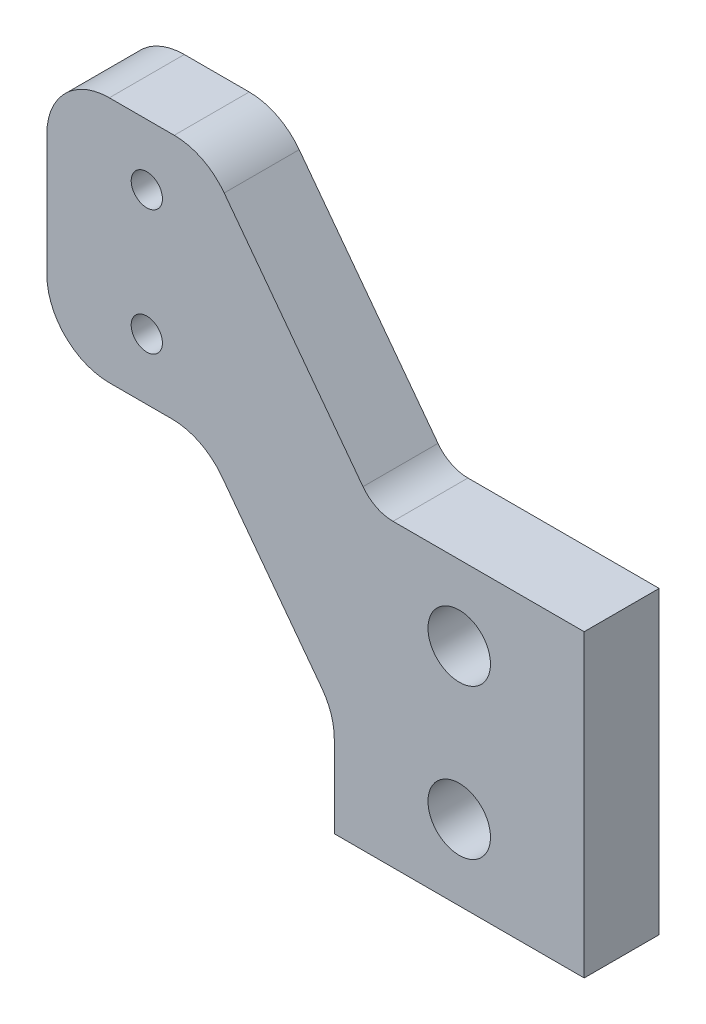
ISO-10303-21;
HEADER;
FILE_DESCRIPTION(('STEP AP214'),'2;1');
FILE_NAME('part.step','',(''),(''),'','','');
FILE_SCHEMA(('AUTOMOTIVE_DESIGN { 1 0 10303 214 1 1 1 1 }'));
ENDSEC;
DATA;
#1=APPLICATION_CONTEXT('core data for automotive mechanical design processes');
#2=APPLICATION_PROTOCOL_DEFINITION('international standard','automotive_design',2000,#1);
#3=PRODUCT_CONTEXT('',#1,'mechanical');
#4=PRODUCT('Part','Part','',(#3));
#5=PRODUCT_RELATED_PRODUCT_CATEGORY('part','',(#4));
#6=PRODUCT_DEFINITION_FORMATION('','',#4);
#7=PRODUCT_DEFINITION_CONTEXT('part definition',#1,'design');
#8=PRODUCT_DEFINITION('design','',#6,#7);
#9=PRODUCT_DEFINITION_SHAPE('','',#8);
#10=(LENGTH_UNIT() NAMED_UNIT(*) SI_UNIT(.MILLI.,.METRE.));
#11=(NAMED_UNIT(*) PLANE_ANGLE_UNIT() SI_UNIT($,.RADIAN.));
#12=(NAMED_UNIT(*) SI_UNIT($,.STERADIAN.) SOLID_ANGLE_UNIT());
#13=UNCERTAINTY_MEASURE_WITH_UNIT(LENGTH_MEASURE(1.E-05),#10,'distance_accuracy_value','');
#14=(GEOMETRIC_REPRESENTATION_CONTEXT(3) GLOBAL_UNCERTAINTY_ASSIGNED_CONTEXT((#13)) GLOBAL_UNIT_ASSIGNED_CONTEXT((#10,
#11,#12)) REPRESENTATION_CONTEXT('',''));
#15=CARTESIAN_POINT('',(0.,0.,0.));
#16=DIRECTION('',(0.,0.,1.));
#17=DIRECTION('',(1.,0.,0.));
#18=AXIS2_PLACEMENT_3D('',#15,#16,#17);
#19=CARTESIAN_POINT('',(5.30636675128094,-35.3975404851727,6.));
#20=DIRECTION('',(0.,0.,1.));
#21=DIRECTION('',(1.,0.,0.));
#22=AXIS2_PLACEMENT_3D('',#19,#20,#21);
#23=PLANE('',#22);
#24=CARTESIAN_POINT('',(-4.69363324871907,-4.875,6.));
#25=DIRECTION('',(0.,0.,1.));
#26=DIRECTION('',(1.,0.,0.));
#27=AXIS2_PLACEMENT_3D('',#24,#25,#26);
#28=CIRCLE('',#27,1.25);
#29=CARTESIAN_POINT('',(-3.44363324871907,-4.875,6.));
#30=VERTEX_POINT('',#29);
#31=EDGE_CURVE('E300',#30,#30,#28,.T.);
#32=ORIENTED_EDGE('',*,*,#31,.F.);
#33=EDGE_LOOP('',(#32));
#34=FACE_BOUND('',#33,.T.);
#35=CARTESIAN_POINT('',(20.3063667512809,-36.,6.));
#36=DIRECTION('',(0.,0.,1.));
#37=DIRECTION('',(1.,0.,0.));
#38=AXIS2_PLACEMENT_3D('',#35,#36,#37);
#39=CIRCLE('',#38,2.5);
#40=CARTESIAN_POINT('',(22.8063667512809,-36.,6.));
#41=VERTEX_POINT('',#40);
#42=EDGE_CURVE('E181',#41,#41,#39,.T.);
#43=ORIENTED_EDGE('',*,*,#42,.F.);
#44=EDGE_LOOP('',(#43));
#45=FACE_BOUND('',#44,.T.);
#46=DIRECTION('',(0.,1.,0.));
#47=VECTOR('',#46,1.);
#48=CARTESIAN_POINT('',(30.3063667512809,-18.,6.));
#49=LINE('',#48,#47);
#50=CARTESIAN_POINT('',(30.3063667512809,-42.,6.));
#51=VERTEX_POINT('',#50);
#52=CARTESIAN_POINT('',(30.3063667512809,-18.,6.));
#53=VERTEX_POINT('',#52);
#54=EDGE_CURVE('E52',#51,#53,#49,.T.);
#55=ORIENTED_EDGE('',*,*,#54,.T.);
#56=DIRECTION('',(-1.,0.,0.));
#57=VECTOR('',#56,1.);
#58=CARTESIAN_POINT('',(15.0054751822955,-18.,6.));
#59=LINE('',#58,#57);
#60=CARTESIAN_POINT('',(15.0054751822955,-18.,6.));
#61=VERTEX_POINT('',#60);
#62=EDGE_CURVE('E117',#53,#61,#59,.T.);
#63=ORIENTED_EDGE('',*,*,#62,.T.);
#64=CARTESIAN_POINT('',(15.0054751822955,-15.,6.));
#65=DIRECTION('',(0.,0.,-1.));
#66=DIRECTION('',(-1.,0.,0.));
#67=AXIS2_PLACEMENT_3D('',#64,#65,#66);
#68=CIRCLE('',#67,3.);
#69=CARTESIAN_POINT('',(12.6058506112339,-16.8005004631928,6.));
#70=VERTEX_POINT('',#69);
#71=EDGE_CURVE('E241',#61,#70,#68,.T.);
#72=ORIENTED_EDGE('',*,*,#71,.T.);
#73=DIRECTION('',(-0.600166821064255,0.799874857020538,0.));
#74=VECTOR('',#73,1.);
#75=CARTESIAN_POINT('',(1.5000259468821,-1.99916589467874,6.));
#76=LINE('',#75,#74);
#77=CARTESIAN_POINT('',(1.5000259468821,-1.99916589467874,6.));
#78=VERTEX_POINT('',#77);
#79=EDGE_CURVE('E261',#70,#78,#76,.T.);
#80=ORIENTED_EDGE('',*,*,#79,.T.);
#81=CARTESIAN_POINT('',(-2.4993483382206,-5.,6.));
#82=DIRECTION('',(0.,0.,1.));
#83=DIRECTION('',(1.,0.,0.));
#84=AXIS2_PLACEMENT_3D('',#81,#82,#83);
#85=CIRCLE('',#84,5.);
#86=CARTESIAN_POINT('',(-2.49934833822063,0.,6.));
#87=VERTEX_POINT('',#86);
#88=EDGE_CURVE('E258',#78,#87,#85,.T.);
#89=ORIENTED_EDGE('',*,*,#88,.T.);
#90=DIRECTION('',(-1.,0.,0.));
#91=VECTOR('',#90,1.);
#92=CARTESIAN_POINT('',(-7.69363324871906,0.,6.));
#93=LINE('',#92,#91);
#94=CARTESIAN_POINT('',(-7.69363324871906,0.,6.));
#95=VERTEX_POINT('',#94);
#96=EDGE_CURVE('E260',#87,#95,#93,.T.);
#97=ORIENTED_EDGE('',*,*,#96,.T.);
#98=CARTESIAN_POINT('',(-7.69363324871906,-5.,6.));
#99=DIRECTION('',(0.,0.,1.));
#100=DIRECTION('',(-1.,0.,0.));
#101=AXIS2_PLACEMENT_3D('',#98,#99,#100);
#102=CIRCLE('',#101,5.);
#103=CARTESIAN_POINT('',(-12.6936332487191,-5.,6.));
#104=VERTEX_POINT('',#103);
#105=EDGE_CURVE('E263',#95,#104,#102,.T.);
#106=ORIENTED_EDGE('',*,*,#105,.T.);
#107=DIRECTION('',(0.,-1.,0.));
#108=VECTOR('',#107,1.);
#109=CARTESIAN_POINT('',(-12.6936332487191,-14.75,6.));
#110=LINE('',#109,#108);
#111=CARTESIAN_POINT('',(-12.6936332487191,-14.75,6.));
#112=VERTEX_POINT('',#111);
#113=EDGE_CURVE('E269',#104,#112,#110,.T.);
#114=ORIENTED_EDGE('',*,*,#113,.T.);
#115=CARTESIAN_POINT('',(-7.69363324871906,-14.75,6.));
#116=DIRECTION('',(0.,0.,1.));
#117=DIRECTION('',(-1.,0.,0.));
#118=AXIS2_PLACEMENT_3D('',#115,#116,#117);
#119=CIRCLE('',#118,5.);
#120=CARTESIAN_POINT('',(-7.69363324871906,-19.75,6.));
#121=VERTEX_POINT('',#120);
#122=EDGE_CURVE('E271',#112,#121,#119,.T.);
#123=ORIENTED_EDGE('',*,*,#122,.T.);
#124=DIRECTION('',(1.,0.,0.));
#125=VECTOR('',#124,1.);
#126=CARTESIAN_POINT('',(-2.6827586338354,-19.75,6.));
#127=LINE('',#126,#125);
#128=CARTESIAN_POINT('',(-2.6827586338354,-19.75,6.));
#129=VERTEX_POINT('',#128);
#130=EDGE_CURVE('E273',#121,#129,#127,.T.);
#131=ORIENTED_EDGE('',*,*,#130,.T.);
#132=CARTESIAN_POINT('',(-2.68275863383537,-24.75,6.));
#133=DIRECTION('',(0.,0.,-1.));
#134=DIRECTION('',(1.,0.,0.));
#135=AXIS2_PLACEMENT_3D('',#132,#133,#134);
#136=CIRCLE('',#135,5.);
#137=CARTESIAN_POINT('',(1.31661565126733,-21.7491658946787,6.));
#138=VERTEX_POINT('',#137);
#139=EDGE_CURVE('E275',#129,#138,#136,.T.);
#140=ORIENTED_EDGE('',*,*,#139,.T.);
#141=DIRECTION('',(0.600166821064255,-0.799874857020538,0.));
#142=VECTOR('',#141,1.);
#143=CARTESIAN_POINT('',(9.30574103638362,-32.3967063798514,6.));
#144=LINE('',#143,#142);
#145=CARTESIAN_POINT('',(9.30574103638362,-32.3967063798514,6.));
#146=VERTEX_POINT('',#145);
#147=EDGE_CURVE('E158',#138,#146,#144,.T.);
#148=ORIENTED_EDGE('',*,*,#147,.T.);
#149=CARTESIAN_POINT('',(5.30636675128094,-35.3975404851727,6.));
#150=DIRECTION('',(0.,0.,-1.));
#151=DIRECTION('',(1.,0.,0.));
#152=AXIS2_PLACEMENT_3D('',#149,#150,#151);
#153=CIRCLE('',#152,5.);
#154=CARTESIAN_POINT('',(10.3063667512809,-35.3975404851727,6.));
#155=VERTEX_POINT('',#154);
#156=EDGE_CURVE('E152',#146,#155,#153,.T.);
#157=ORIENTED_EDGE('',*,*,#156,.T.);
#158=DIRECTION('',(0.,-1.,0.));
#159=VECTOR('',#158,1.);
#160=CARTESIAN_POINT('',(10.3063667512809,-42.,6.));
#161=LINE('',#160,#159);
#162=CARTESIAN_POINT('',(10.3063667512809,-42.,6.));
#163=VERTEX_POINT('',#162);
#164=EDGE_CURVE('E156',#155,#163,#161,.T.);
#165=ORIENTED_EDGE('',*,*,#164,.T.);
#166=DIRECTION('',(1.,0.,0.));
#167=VECTOR('',#166,1.);
#168=CARTESIAN_POINT('',(30.3063667512809,-42.,6.));
#169=LINE('',#168,#167);
#170=EDGE_CURVE('E172',#163,#51,#169,.T.);
#171=ORIENTED_EDGE('',*,*,#170,.T.);
#172=EDGE_LOOP('',(#55,#63,#72,#80,#89,#97,#106,#114,#123,#131,#140,#148,#157,#165,#171));
#173=FACE_BOUND('',#172,.T.);
#174=CARTESIAN_POINT('',(20.3063667512809,-24.,6.));
#175=DIRECTION('',(0.,0.,1.));
#176=DIRECTION('',(1.,0.,0.));
#177=AXIS2_PLACEMENT_3D('',#174,#175,#176);
#178=CIRCLE('',#177,2.5);
#179=CARTESIAN_POINT('',(22.8063667512809,-24.,6.));
#180=VERTEX_POINT('',#179);
#181=EDGE_CURVE('E294',#180,#180,#178,.T.);
#182=ORIENTED_EDGE('',*,*,#181,.F.);
#183=EDGE_LOOP('',(#182));
#184=FACE_BOUND('',#183,.T.);
#185=CARTESIAN_POINT('',(-4.69363324871906,-14.875,6.));
#186=DIRECTION('',(0.,0.,1.));
#187=DIRECTION('',(1.,0.,0.));
#188=AXIS2_PLACEMENT_3D('',#185,#186,#187);
#189=CIRCLE('',#188,1.25);
#190=CARTESIAN_POINT('',(-3.44363324871906,-14.875,6.));
#191=VERTEX_POINT('',#190);
#192=EDGE_CURVE('E306',#191,#191,#189,.T.);
#193=ORIENTED_EDGE('',*,*,#192,.F.);
#194=EDGE_LOOP('',(#193));
#195=FACE_BOUND('',#194,.T.);
#196=ADVANCED_FACE('F35',(#34,#45,#173,#184,#195),#23,.T.);
#197=CARTESIAN_POINT('',(5.30636675128094,-35.3975404851727,0.));
#198=DIRECTION('',(0.,0.,1.));
#199=DIRECTION('',(1.,0.,0.));
#200=AXIS2_PLACEMENT_3D('',#197,#198,#199);
#201=PLANE('',#200);
#202=DIRECTION('',(-1.,0.,0.));
#203=VECTOR('',#202,1.);
#204=CARTESIAN_POINT('',(15.0054751822955,-18.,0.));
#205=LINE('',#204,#203);
#206=CARTESIAN_POINT('',(30.3063667512809,-18.,0.));
#207=VERTEX_POINT('',#206);
#208=CARTESIAN_POINT('',(15.0054751822955,-18.,0.));
#209=VERTEX_POINT('',#208);
#210=EDGE_CURVE('E178',#207,#209,#205,.T.);
#211=ORIENTED_EDGE('',*,*,#210,.F.);
#212=DIRECTION('',(0.,1.,0.));
#213=VECTOR('',#212,1.);
#214=CARTESIAN_POINT('',(30.3063667512809,-32.6148542997745,0.));
#215=LINE('',#214,#213);
#216=CARTESIAN_POINT('',(30.3063667512809,-42.,0.));
#217=VERTEX_POINT('',#216);
#218=EDGE_CURVE('E204',#217,#207,#215,.T.);
#219=ORIENTED_EDGE('',*,*,#218,.F.);
#220=DIRECTION('',(1.,0.,0.));
#221=VECTOR('',#220,1.);
#222=CARTESIAN_POINT('',(30.3063667512809,-42.,0.));
#223=LINE('',#222,#221);
#224=CARTESIAN_POINT('',(10.3063667512809,-42.,0.));
#225=VERTEX_POINT('',#224);
#226=EDGE_CURVE('E110',#225,#217,#223,.T.);
#227=ORIENTED_EDGE('',*,*,#226,.F.);
#228=DIRECTION('',(0.,-1.,0.));
#229=VECTOR('',#228,1.);
#230=CARTESIAN_POINT('',(10.3063667512809,-42.,0.));
#231=LINE('',#230,#229);
#232=CARTESIAN_POINT('',(10.3063667512809,-35.3975404851727,0.));
#233=VERTEX_POINT('',#232);
#234=EDGE_CURVE('E103',#233,#225,#231,.T.);
#235=ORIENTED_EDGE('',*,*,#234,.F.);
#236=CARTESIAN_POINT('',(5.30636675128094,-35.3975404851727,0.));
#237=DIRECTION('',(0.,0.,-1.));
#238=DIRECTION('',(1.,0.,0.));
#239=AXIS2_PLACEMENT_3D('',#236,#237,#238);
#240=CIRCLE('',#239,5.);
#241=CARTESIAN_POINT('',(9.30574103638362,-32.3967063798514,0.));
#242=VERTEX_POINT('',#241);
#243=EDGE_CURVE('E166',#242,#233,#240,.T.);
#244=ORIENTED_EDGE('',*,*,#243,.F.);
#245=DIRECTION('',(0.600166821064255,-0.799874857020538,0.));
#246=VECTOR('',#245,1.);
#247=CARTESIAN_POINT('',(9.30574103638362,-32.3967063798514,0.));
#248=LINE('',#247,#246);
#249=CARTESIAN_POINT('',(1.31661565126733,-21.7491658946787,0.));
#250=VERTEX_POINT('',#249);
#251=EDGE_CURVE('E199',#250,#242,#248,.T.);
#252=ORIENTED_EDGE('',*,*,#251,.F.);
#253=CARTESIAN_POINT('',(-2.68275863383537,-24.75,0.));
#254=DIRECTION('',(0.,0.,-1.));
#255=DIRECTION('',(1.,0.,0.));
#256=AXIS2_PLACEMENT_3D('',#253,#254,#255);
#257=CIRCLE('',#256,5.);
#258=CARTESIAN_POINT('',(-2.6827586338354,-19.75,0.));
#259=VERTEX_POINT('',#258);
#260=EDGE_CURVE('E197',#259,#250,#257,.T.);
#261=ORIENTED_EDGE('',*,*,#260,.F.);
#262=DIRECTION('',(1.,0.,0.));
#263=VECTOR('',#262,1.);
#264=CARTESIAN_POINT('',(-2.6827586338354,-19.75,0.));
#265=LINE('',#264,#263);
#266=CARTESIAN_POINT('',(-7.69363324871906,-19.75,0.));
#267=VERTEX_POINT('',#266);
#268=EDGE_CURVE('E195',#267,#259,#265,.T.);
#269=ORIENTED_EDGE('',*,*,#268,.F.);
#270=CARTESIAN_POINT('',(-7.69363324871906,-14.75,0.));
#271=DIRECTION('',(0.,0.,1.));
#272=DIRECTION('',(-1.,0.,0.));
#273=AXIS2_PLACEMENT_3D('',#270,#271,#272);
#274=CIRCLE('',#273,5.);
#275=CARTESIAN_POINT('',(-12.6936332487191,-14.75,0.));
#276=VERTEX_POINT('',#275);
#277=EDGE_CURVE('E193',#276,#267,#274,.T.);
#278=ORIENTED_EDGE('',*,*,#277,.F.);
#279=DIRECTION('',(0.,-1.,0.));
#280=VECTOR('',#279,1.);
#281=CARTESIAN_POINT('',(-12.6936332487191,-14.75,0.));
#282=LINE('',#281,#280);
#283=CARTESIAN_POINT('',(-12.6936332487191,-5.,0.));
#284=VERTEX_POINT('',#283);
#285=EDGE_CURVE('E191',#284,#276,#282,.T.);
#286=ORIENTED_EDGE('',*,*,#285,.F.);
#287=CARTESIAN_POINT('',(-7.69363324871906,-5.,0.));
#288=DIRECTION('',(0.,0.,1.));
#289=DIRECTION('',(-1.,0.,0.));
#290=AXIS2_PLACEMENT_3D('',#287,#288,#289);
#291=CIRCLE('',#290,5.);
#292=CARTESIAN_POINT('',(-7.69363324871906,0.,0.));
#293=VERTEX_POINT('',#292);
#294=EDGE_CURVE('E189',#293,#284,#291,.T.);
#295=ORIENTED_EDGE('',*,*,#294,.F.);
#296=DIRECTION('',(-1.,0.,0.));
#297=VECTOR('',#296,1.);
#298=CARTESIAN_POINT('',(-7.69363324871906,0.,0.));
#299=LINE('',#298,#297);
#300=CARTESIAN_POINT('',(-2.49934833822063,0.,0.));
#301=VERTEX_POINT('',#300);
#302=EDGE_CURVE('E187',#301,#293,#299,.T.);
#303=ORIENTED_EDGE('',*,*,#302,.F.);
#304=CARTESIAN_POINT('',(-2.4993483382206,-5.,0.));
#305=DIRECTION('',(0.,0.,1.));
#306=DIRECTION('',(1.,0.,0.));
#307=AXIS2_PLACEMENT_3D('',#304,#305,#306);
#308=CIRCLE('',#307,5.);
#309=CARTESIAN_POINT('',(1.5000259468821,-1.99916589467874,0.));
#310=VERTEX_POINT('',#309);
#311=EDGE_CURVE('E185',#310,#301,#308,.T.);
#312=ORIENTED_EDGE('',*,*,#311,.F.);
#313=DIRECTION('',(-0.600166821064255,0.799874857020538,0.));
#314=VECTOR('',#313,1.);
#315=CARTESIAN_POINT('',(1.5000259468821,-1.99916589467874,0.));
#316=LINE('',#315,#314);
#317=CARTESIAN_POINT('',(12.6058506112339,-16.8005004631928,0.));
#318=VERTEX_POINT('',#317);
#319=EDGE_CURVE('E183',#318,#310,#316,.T.);
#320=ORIENTED_EDGE('',*,*,#319,.F.);
#321=CARTESIAN_POINT('',(15.0054751822955,-15.,0.));
#322=DIRECTION('',(0.,0.,-1.));
#323=DIRECTION('',(-1.,0.,0.));
#324=AXIS2_PLACEMENT_3D('',#321,#322,#323);
#325=CIRCLE('',#324,3.);
#326=EDGE_CURVE('E180',#209,#318,#325,.T.);
#327=ORIENTED_EDGE('',*,*,#326,.F.);
#328=EDGE_LOOP('',(#211,#219,#227,#235,#244,#252,#261,#269,#278,#286,#295,#303,#312,#320,#327));
#329=FACE_BOUND('',#328,.T.);
#330=CARTESIAN_POINT('',(20.3063667512809,-36.,0.));
#331=DIRECTION('',(0.,0.,1.));
#332=DIRECTION('',(1.,0.,0.));
#333=AXIS2_PLACEMENT_3D('',#330,#331,#332);
#334=CIRCLE('',#333,2.5);
#335=CARTESIAN_POINT('',(22.8063667512809,-36.,0.));
#336=VERTEX_POINT('',#335);
#337=EDGE_CURVE('E291',#336,#336,#334,.T.);
#338=ORIENTED_EDGE('',*,*,#337,.T.);
#339=EDGE_LOOP('',(#338));
#340=FACE_BOUND('',#339,.T.);
#341=CARTESIAN_POINT('',(20.3063667512809,-24.,0.));
#342=DIRECTION('',(0.,0.,1.));
#343=DIRECTION('',(1.,0.,0.));
#344=AXIS2_PLACEMENT_3D('',#341,#342,#343);
#345=CIRCLE('',#344,2.5);
#346=CARTESIAN_POINT('',(22.8063667512809,-24.,0.));
#347=VERTEX_POINT('',#346);
#348=EDGE_CURVE('E297',#347,#347,#345,.T.);
#349=ORIENTED_EDGE('',*,*,#348,.T.);
#350=EDGE_LOOP('',(#349));
#351=FACE_BOUND('',#350,.T.);
#352=CARTESIAN_POINT('',(-4.69363324871907,-4.875,0.));
#353=DIRECTION('',(0.,0.,1.));
#354=DIRECTION('',(1.,0.,0.));
#355=AXIS2_PLACEMENT_3D('',#352,#353,#354);
#356=CIRCLE('',#355,1.25);
#357=CARTESIAN_POINT('',(-3.44363324871907,-4.875,0.));
#358=VERTEX_POINT('',#357);
#359=EDGE_CURVE('E303',#358,#358,#356,.T.);
#360=ORIENTED_EDGE('',*,*,#359,.T.);
#361=EDGE_LOOP('',(#360));
#362=FACE_BOUND('',#361,.T.);
#363=CARTESIAN_POINT('',(-4.69363324871906,-14.875,0.));
#364=DIRECTION('',(0.,0.,1.));
#365=DIRECTION('',(1.,0.,0.));
#366=AXIS2_PLACEMENT_3D('',#363,#364,#365);
#367=CIRCLE('',#366,1.25);
#368=CARTESIAN_POINT('',(-3.44363324871906,-14.875,0.));
#369=VERTEX_POINT('',#368);
#370=EDGE_CURVE('E309',#369,#369,#367,.T.);
#371=ORIENTED_EDGE('',*,*,#370,.T.);
#372=EDGE_LOOP('',(#371));
#373=FACE_BOUND('',#372,.T.);
#374=ADVANCED_FACE('F245',(#329,#340,#351,#362,#373),#201,.F.);
#375=CARTESIAN_POINT('',(15.0054751822955,-18.,6.));
#376=DIRECTION('',(0.,-1.,0.));
#377=DIRECTION('',(0.,0.,-1.));
#378=AXIS2_PLACEMENT_3D('',#375,#376,#377);
#379=PLANE('',#378);
#380=ORIENTED_EDGE('',*,*,#210,.T.);
#381=DIRECTION('',(0.,0.,-1.));
#382=VECTOR('',#381,1.);
#383=CARTESIAN_POINT('',(15.0054751822955,-18.,6.));
#384=LINE('',#383,#382);
#385=EDGE_CURVE('E44',#61,#209,#384,.T.);
#386=ORIENTED_EDGE('',*,*,#385,.F.);
#387=ORIENTED_EDGE('',*,*,#62,.F.);
#388=DIRECTION('',(0.,0.,-1.));
#389=VECTOR('',#388,1.);
#390=CARTESIAN_POINT('',(30.3063667512809,-18.,6.));
#391=LINE('',#390,#389);
#392=EDGE_CURVE('E11',#53,#207,#391,.T.);
#393=ORIENTED_EDGE('',*,*,#392,.T.);
#394=EDGE_LOOP('',(#380,#386,#387,#393));
#395=FACE_BOUND('',#394,.T.);
#396=ADVANCED_FACE('F37',(#395),#379,.F.);
#397=CARTESIAN_POINT('',(15.0054751822955,-15.,6.));
#398=DIRECTION('',(0.,0.,-1.));
#399=DIRECTION('',(-1.,0.,0.));
#400=AXIS2_PLACEMENT_3D('',#397,#398,#399);
#401=CYLINDRICAL_SURFACE('',#400,3.);
#402=ORIENTED_EDGE('',*,*,#326,.T.);
#403=DIRECTION('',(0.,0.,-1.));
#404=VECTOR('',#403,1.);
#405=CARTESIAN_POINT('',(12.6058506112339,-16.8005004631928,6.));
#406=LINE('',#405,#404);
#407=EDGE_CURVE('E233',#70,#318,#406,.T.);
#408=ORIENTED_EDGE('',*,*,#407,.F.);
#409=ORIENTED_EDGE('',*,*,#71,.F.);
#410=ORIENTED_EDGE('',*,*,#385,.T.);
#411=EDGE_LOOP('',(#402,#408,#409,#410));
#412=FACE_BOUND('',#411,.T.);
#413=ADVANCED_FACE('F239',(#412),#401,.F.);
#414=CARTESIAN_POINT('',(1.5000259468821,-1.99916589467874,6.));
#415=DIRECTION('',(-0.799874857020538,-0.600166821064255,0.));
#416=DIRECTION('',(0.600166821064255,-0.799874857020538,0.));
#417=AXIS2_PLACEMENT_3D('',#414,#415,#416);
#418=PLANE('',#417);
#419=ORIENTED_EDGE('',*,*,#319,.T.);
#420=DIRECTION('',(0.,0.,-1.));
#421=VECTOR('',#420,1.);
#422=CARTESIAN_POINT('',(1.5000259468821,-1.99916589467874,6.));
#423=LINE('',#422,#421);
#424=EDGE_CURVE('E230',#78,#310,#423,.T.);
#425=ORIENTED_EDGE('',*,*,#424,.F.);
#426=ORIENTED_EDGE('',*,*,#79,.F.);
#427=ORIENTED_EDGE('',*,*,#407,.T.);
#428=EDGE_LOOP('',(#419,#425,#426,#427));
#429=FACE_BOUND('',#428,.T.);
#430=ADVANCED_FACE('F252',(#429),#418,.F.);
#431=CARTESIAN_POINT('',(-2.4993483382206,-5.,6.));
#432=DIRECTION('',(0.,0.,-1.));
#433=DIRECTION('',(-1.,0.,0.));
#434=AXIS2_PLACEMENT_3D('',#431,#432,#433);
#435=CYLINDRICAL_SURFACE('',#434,5.);
#436=ORIENTED_EDGE('',*,*,#311,.T.);
#437=DIRECTION('',(0.,0.,-1.));
#438=VECTOR('',#437,1.);
#439=CARTESIAN_POINT('',(-2.49934833822063,0.,6.));
#440=LINE('',#439,#438);
#441=EDGE_CURVE('E227',#87,#301,#440,.T.);
#442=ORIENTED_EDGE('',*,*,#441,.F.);
#443=ORIENTED_EDGE('',*,*,#88,.F.);
#444=ORIENTED_EDGE('',*,*,#424,.T.);
#445=EDGE_LOOP('',(#436,#442,#443,#444));
#446=FACE_BOUND('',#445,.T.);
#447=ADVANCED_FACE('F256',(#446),#435,.T.);
#448=CARTESIAN_POINT('',(-7.69363324871906,0.,6.));
#449=DIRECTION('',(0.,-1.,0.));
#450=DIRECTION('',(0.,0.,-1.));
#451=AXIS2_PLACEMENT_3D('',#448,#449,#450);
#452=PLANE('',#451);
#453=ORIENTED_EDGE('',*,*,#302,.T.);
#454=DIRECTION('',(0.,0.,-1.));
#455=VECTOR('',#454,1.);
#456=CARTESIAN_POINT('',(-7.69363324871906,0.,6.));
#457=LINE('',#456,#455);
#458=EDGE_CURVE('E224',#95,#293,#457,.T.);
#459=ORIENTED_EDGE('',*,*,#458,.F.);
#460=ORIENTED_EDGE('',*,*,#96,.F.);
#461=ORIENTED_EDGE('',*,*,#441,.T.);
#462=EDGE_LOOP('',(#453,#459,#460,#461));
#463=FACE_BOUND('',#462,.T.);
#464=ADVANCED_FACE('F358',(#463),#452,.F.);
#465=CARTESIAN_POINT('',(-7.69363324871906,-5.,6.));
#466=DIRECTION('',(0.,0.,-1.));
#467=DIRECTION('',(-1.,0.,0.));
#468=AXIS2_PLACEMENT_3D('',#465,#466,#467);
#469=CYLINDRICAL_SURFACE('',#468,5.);
#470=ORIENTED_EDGE('',*,*,#294,.T.);
#471=DIRECTION('',(0.,0.,-1.));
#472=VECTOR('',#471,1.);
#473=CARTESIAN_POINT('',(-12.6936332487191,-5.,6.));
#474=LINE('',#473,#472);
#475=EDGE_CURVE('E221',#104,#284,#474,.T.);
#476=ORIENTED_EDGE('',*,*,#475,.F.);
#477=ORIENTED_EDGE('',*,*,#105,.F.);
#478=ORIENTED_EDGE('',*,*,#458,.T.);
#479=EDGE_LOOP('',(#470,#476,#477,#478));
#480=FACE_BOUND('',#479,.T.);
#481=ADVANCED_FACE('F354',(#480),#469,.T.);
#482=CARTESIAN_POINT('',(-12.6936332487191,-14.75,6.));
#483=DIRECTION('',(1.,0.,0.));
#484=DIRECTION('',(0.,0.,-1.));
#485=AXIS2_PLACEMENT_3D('',#482,#483,#484);
#486=PLANE('',#485);
#487=ORIENTED_EDGE('',*,*,#285,.T.);
#488=DIRECTION('',(0.,0.,-1.));
#489=VECTOR('',#488,1.);
#490=CARTESIAN_POINT('',(-12.6936332487191,-14.75,6.));
#491=LINE('',#490,#489);
#492=EDGE_CURVE('E218',#112,#276,#491,.T.);
#493=ORIENTED_EDGE('',*,*,#492,.F.);
#494=ORIENTED_EDGE('',*,*,#113,.F.);
#495=ORIENTED_EDGE('',*,*,#475,.T.);
#496=EDGE_LOOP('',(#487,#493,#494,#495));
#497=FACE_BOUND('',#496,.T.);
#498=ADVANCED_FACE('F350',(#497),#486,.F.);
#499=CARTESIAN_POINT('',(-7.69363324871906,-14.75,6.));
#500=DIRECTION('',(0.,0.,-1.));
#501=DIRECTION('',(-1.,0.,0.));
#502=AXIS2_PLACEMENT_3D('',#499,#500,#501);
#503=CYLINDRICAL_SURFACE('',#502,5.);
#504=ORIENTED_EDGE('',*,*,#277,.T.);
#505=DIRECTION('',(0.,0.,-1.));
#506=VECTOR('',#505,1.);
#507=CARTESIAN_POINT('',(-7.69363324871906,-19.75,6.));
#508=LINE('',#507,#506);
#509=EDGE_CURVE('E215',#121,#267,#508,.T.);
#510=ORIENTED_EDGE('',*,*,#509,.F.);
#511=ORIENTED_EDGE('',*,*,#122,.F.);
#512=ORIENTED_EDGE('',*,*,#492,.T.);
#513=EDGE_LOOP('',(#504,#510,#511,#512));
#514=FACE_BOUND('',#513,.T.);
#515=ADVANCED_FACE('F346',(#514),#503,.T.);
#516=CARTESIAN_POINT('',(-2.6827586338354,-19.75,6.));
#517=DIRECTION('',(0.,1.,0.));
#518=DIRECTION('',(-1.,0.,0.));
#519=AXIS2_PLACEMENT_3D('',#516,#517,#518);
#520=PLANE('',#519);
#521=ORIENTED_EDGE('',*,*,#268,.T.);
#522=DIRECTION('',(0.,0.,-1.));
#523=VECTOR('',#522,1.);
#524=CARTESIAN_POINT('',(-2.6827586338354,-19.75,6.));
#525=LINE('',#524,#523);
#526=EDGE_CURVE('E212',#129,#259,#525,.T.);
#527=ORIENTED_EDGE('',*,*,#526,.F.);
#528=ORIENTED_EDGE('',*,*,#130,.F.);
#529=ORIENTED_EDGE('',*,*,#509,.T.);
#530=EDGE_LOOP('',(#521,#527,#528,#529));
#531=FACE_BOUND('',#530,.T.);
#532=ADVANCED_FACE('F343',(#531),#520,.F.);
#533=CARTESIAN_POINT('',(-2.68275863383537,-24.75,6.));
#534=DIRECTION('',(0.,0.,-1.));
#535=DIRECTION('',(-1.,0.,0.));
#536=AXIS2_PLACEMENT_3D('',#533,#534,#535);
#537=CYLINDRICAL_SURFACE('',#536,5.);
#538=ORIENTED_EDGE('',*,*,#260,.T.);
#539=DIRECTION('',(0.,0.,-1.));
#540=VECTOR('',#539,1.);
#541=CARTESIAN_POINT('',(1.31661565126733,-21.7491658946787,6.));
#542=LINE('',#541,#540);
#543=EDGE_CURVE('E209',#138,#250,#542,.T.);
#544=ORIENTED_EDGE('',*,*,#543,.F.);
#545=ORIENTED_EDGE('',*,*,#139,.F.);
#546=ORIENTED_EDGE('',*,*,#526,.T.);
#547=EDGE_LOOP('',(#538,#544,#545,#546));
#548=FACE_BOUND('',#547,.T.);
#549=ADVANCED_FACE('F281',(#548),#537,.F.);
#550=CARTESIAN_POINT('',(9.30574103638362,-32.3967063798514,6.));
#551=DIRECTION('',(0.799874857020538,0.600166821064255,0.));
#552=DIRECTION('',(-0.600166821064255,0.799874857020538,0.));
#553=AXIS2_PLACEMENT_3D('',#550,#551,#552);
#554=PLANE('',#553);
#555=ORIENTED_EDGE('',*,*,#251,.T.);
#556=DIRECTION('',(0.,0.,-1.));
#557=VECTOR('',#556,1.);
#558=CARTESIAN_POINT('',(9.30574103638362,-32.3967063798514,6.));
#559=LINE('',#558,#557);
#560=EDGE_CURVE('E167',#146,#242,#559,.T.);
#561=ORIENTED_EDGE('',*,*,#560,.F.);
#562=ORIENTED_EDGE('',*,*,#147,.F.);
#563=ORIENTED_EDGE('',*,*,#543,.T.);
#564=EDGE_LOOP('',(#555,#561,#562,#563));
#565=FACE_BOUND('',#564,.T.);
#566=ADVANCED_FACE('F285',(#565),#554,.F.);
#567=CARTESIAN_POINT('',(5.30636675128094,-35.3975404851727,6.));
#568=DIRECTION('',(0.,0.,-1.));
#569=DIRECTION('',(-1.,0.,0.));
#570=AXIS2_PLACEMENT_3D('',#567,#568,#569);
#571=CYLINDRICAL_SURFACE('',#570,5.);
#572=ORIENTED_EDGE('',*,*,#243,.T.);
#573=DIRECTION('',(0.,0.,-1.));
#574=VECTOR('',#573,1.);
#575=CARTESIAN_POINT('',(10.3063667512809,-35.3975404851727,6.));
#576=LINE('',#575,#574);
#577=EDGE_CURVE('E163',#155,#233,#576,.T.);
#578=ORIENTED_EDGE('',*,*,#577,.F.);
#579=ORIENTED_EDGE('',*,*,#156,.F.);
#580=ORIENTED_EDGE('',*,*,#560,.T.);
#581=EDGE_LOOP('',(#572,#578,#579,#580));
#582=FACE_BOUND('',#581,.T.);
#583=ADVANCED_FACE('F164',(#582),#571,.F.);
#584=CARTESIAN_POINT('',(10.3063667512809,-42.,6.));
#585=DIRECTION('',(1.,0.,0.));
#586=DIRECTION('',(0.,0.,-1.));
#587=AXIS2_PLACEMENT_3D('',#584,#585,#586);
#588=PLANE('',#587);
#589=ORIENTED_EDGE('',*,*,#234,.T.);
#590=DIRECTION('',(0.,0.,-1.));
#591=VECTOR('',#590,1.);
#592=CARTESIAN_POINT('',(10.3063667512809,-42.,6.));
#593=LINE('',#592,#591);
#594=EDGE_CURVE('E168',#163,#225,#593,.T.);
#595=ORIENTED_EDGE('',*,*,#594,.F.);
#596=ORIENTED_EDGE('',*,*,#164,.F.);
#597=ORIENTED_EDGE('',*,*,#577,.T.);
#598=EDGE_LOOP('',(#589,#595,#596,#597));
#599=FACE_BOUND('',#598,.T.);
#600=ADVANCED_FACE('F170',(#599),#588,.F.);
#601=CARTESIAN_POINT('',(30.3063667512809,-42.,6.));
#602=DIRECTION('',(0.,1.,0.));
#603=DIRECTION('',(0.,0.,1.));
#604=AXIS2_PLACEMENT_3D('',#601,#602,#603);
#605=PLANE('',#604);
#606=ORIENTED_EDGE('',*,*,#226,.T.);
#607=DIRECTION('',(0.,0.,-1.));
#608=VECTOR('',#607,1.);
#609=CARTESIAN_POINT('',(30.3063667512809,-42.,6.));
#610=LINE('',#609,#608);
#611=EDGE_CURVE('E174',#51,#217,#610,.T.);
#612=ORIENTED_EDGE('',*,*,#611,.F.);
#613=ORIENTED_EDGE('',*,*,#170,.F.);
#614=ORIENTED_EDGE('',*,*,#594,.T.);
#615=EDGE_LOOP('',(#606,#612,#613,#614));
#616=FACE_BOUND('',#615,.T.);
#617=ADVANCED_FACE('F287',(#616),#605,.F.);
#618=CARTESIAN_POINT('',(30.3063667512809,-32.6148542997745,6.));
#619=DIRECTION('',(-1.,0.,0.));
#620=DIRECTION('',(0.,0.,1.));
#621=AXIS2_PLACEMENT_3D('',#618,#619,#620);
#622=PLANE('',#621);
#623=ORIENTED_EDGE('',*,*,#218,.T.);
#624=ORIENTED_EDGE('',*,*,#392,.F.);
#625=ORIENTED_EDGE('',*,*,#54,.F.);
#626=ORIENTED_EDGE('',*,*,#611,.T.);
#627=EDGE_LOOP('',(#623,#624,#625,#626));
#628=FACE_BOUND('',#627,.T.);
#629=ADVANCED_FACE('F286',(#628),#622,.F.);
#630=CARTESIAN_POINT('',(20.3063667512809,-36.,6.));
#631=DIRECTION('',(0.,0.,-1.));
#632=DIRECTION('',(-1.,0.,0.));
#633=AXIS2_PLACEMENT_3D('',#630,#631,#632);
#634=CYLINDRICAL_SURFACE('',#633,2.5);
#635=ORIENTED_EDGE('',*,*,#42,.T.);
#636=EDGE_LOOP('',(#635));
#637=FACE_BOUND('',#636,.T.);
#638=ORIENTED_EDGE('',*,*,#337,.F.);
#639=EDGE_LOOP('',(#638));
#640=FACE_BOUND('',#639,.T.);
#641=ADVANCED_FACE('F328',(#637,#640),#634,.F.);
#642=CARTESIAN_POINT('',(20.3063667512809,-24.,6.));
#643=DIRECTION('',(0.,0.,-1.));
#644=DIRECTION('',(-1.,0.,0.));
#645=AXIS2_PLACEMENT_3D('',#642,#643,#644);
#646=CYLINDRICAL_SURFACE('',#645,2.5);
#647=ORIENTED_EDGE('',*,*,#181,.T.);
#648=EDGE_LOOP('',(#647));
#649=FACE_BOUND('',#648,.T.);
#650=ORIENTED_EDGE('',*,*,#348,.F.);
#651=EDGE_LOOP('',(#650));
#652=FACE_BOUND('',#651,.T.);
#653=ADVANCED_FACE('F464',(#649,#652),#646,.F.);
#654=CARTESIAN_POINT('',(-4.69363324871907,-4.875,6.));
#655=DIRECTION('',(0.,0.,-1.));
#656=DIRECTION('',(-1.,0.,0.));
#657=AXIS2_PLACEMENT_3D('',#654,#655,#656);
#658=CYLINDRICAL_SURFACE('',#657,1.25);
#659=ORIENTED_EDGE('',*,*,#31,.T.);
#660=EDGE_LOOP('',(#659));
#661=FACE_BOUND('',#660,.T.);
#662=ORIENTED_EDGE('',*,*,#359,.F.);
#663=EDGE_LOOP('',(#662));
#664=FACE_BOUND('',#663,.T.);
#665=ADVANCED_FACE('F472',(#661,#664),#658,.F.);
#666=CARTESIAN_POINT('',(-4.69363324871906,-14.875,6.));
#667=DIRECTION('',(0.,0.,-1.));
#668=DIRECTION('',(-1.,0.,0.));
#669=AXIS2_PLACEMENT_3D('',#666,#667,#668);
#670=CYLINDRICAL_SURFACE('',#669,1.25);
#671=ORIENTED_EDGE('',*,*,#192,.T.);
#672=EDGE_LOOP('',(#671));
#673=FACE_BOUND('',#672,.T.);
#674=ORIENTED_EDGE('',*,*,#370,.F.);
#675=EDGE_LOOP('',(#674));
#676=FACE_BOUND('',#675,.T.);
#677=ADVANCED_FACE('F315',(#673,#676),#670,.F.);
#678=CLOSED_SHELL('',(#196,#374,#396,#413,#430,#447,#464,#481,#498,#515,#532,#549,#566,#583,
#600,#617,#629,#641,#653,#665,#677));
#679=MANIFOLD_SOLID_BREP('B2',#678);
#680=ADVANCED_BREP_SHAPE_REPRESENTATION('',(#18,#679),#14);
#681=SHAPE_DEFINITION_REPRESENTATION(#9,#680);
ENDSEC;
END-ISO-10303-21;
